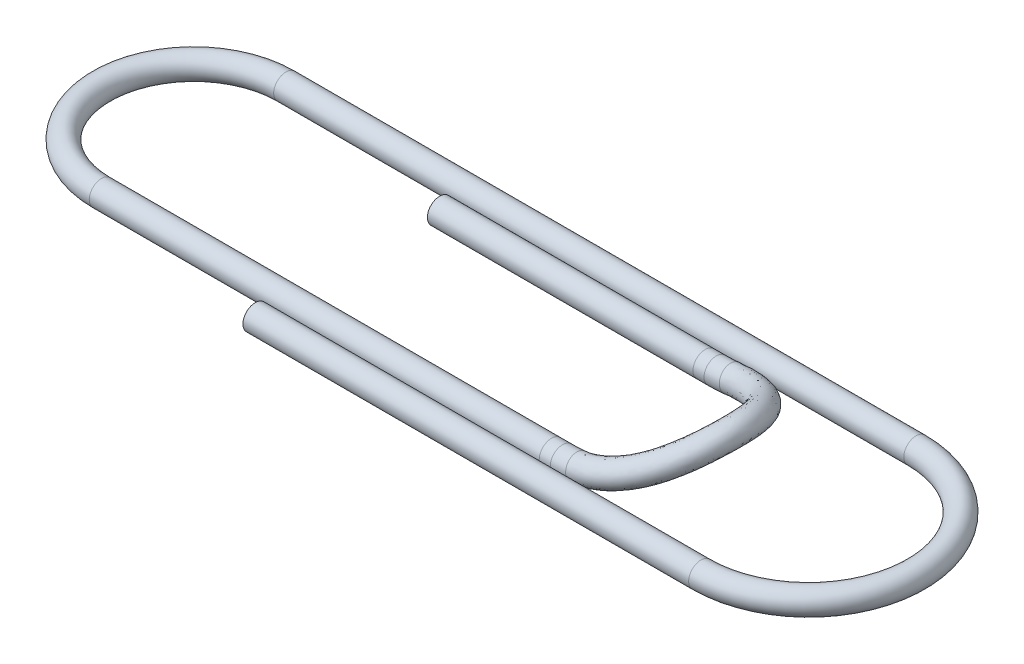
ISO-10303-21;
HEADER;
FILE_DESCRIPTION(('STEP AP214'),'2;1');
FILE_NAME('part.step','',(''),(''),'','','');
FILE_SCHEMA(('AUTOMOTIVE_DESIGN { 1 0 10303 214 1 1 1 1 }'));
ENDSEC;
DATA;
#1=APPLICATION_CONTEXT('core data for automotive mechanical design processes');
#2=APPLICATION_PROTOCOL_DEFINITION('international standard','automotive_design',2000,#1);
#3=PRODUCT_CONTEXT('',#1,'mechanical');
#4=PRODUCT('Part','Part','',(#3));
#5=PRODUCT_RELATED_PRODUCT_CATEGORY('part','',(#4));
#6=PRODUCT_DEFINITION_FORMATION('','',#4);
#7=PRODUCT_DEFINITION_CONTEXT('part definition',#1,'design');
#8=PRODUCT_DEFINITION('design','',#6,#7);
#9=PRODUCT_DEFINITION_SHAPE('','',#8);
#10=(LENGTH_UNIT() NAMED_UNIT(*) SI_UNIT(.MILLI.,.METRE.));
#11=(NAMED_UNIT(*) PLANE_ANGLE_UNIT() SI_UNIT($,.RADIAN.));
#12=(NAMED_UNIT(*) SI_UNIT($,.STERADIAN.) SOLID_ANGLE_UNIT());
#13=UNCERTAINTY_MEASURE_WITH_UNIT(LENGTH_MEASURE(1.E-05),#10,'distance_accuracy_value','');
#14=(GEOMETRIC_REPRESENTATION_CONTEXT(3) GLOBAL_UNCERTAINTY_ASSIGNED_CONTEXT((#13)) GLOBAL_UNIT_ASSIGNED_CONTEXT((#10,
#11,#12)) REPRESENTATION_CONTEXT('',''));
#15=CARTESIAN_POINT('',(0.,0.,0.));
#16=DIRECTION('',(0.,0.,1.));
#17=DIRECTION('',(1.,0.,0.));
#18=AXIS2_PLACEMENT_3D('',#15,#16,#17);
#19=CARTESIAN_POINT('',(0.,0.,6.));
#20=DIRECTION('',(-1.,0.,0.));
#21=DIRECTION('',(0.,-3.67789796320017E-05,0.999999999323653));
#22=AXIS2_PLACEMENT_3D('',#19,#20,#21);
#23=PLANE('',#22);
#24=CARTESIAN_POINT('',(0.,0.,6.));
#25=DIRECTION('',(-1.,0.,0.));
#26=DIRECTION('',(0.,-3.67789796320017E-05,0.999999999323653));
#27=AXIS2_PLACEMENT_3D('',#24,#25,#26);
#28=CIRCLE('',#27,0.4);
#29=CARTESIAN_POINT('',(0.,-1.47115918528007E-05,6.39999999972946));
#30=VERTEX_POINT('',#29);
#31=EDGE_CURVE('E146',#30,#30,#28,.T.);
#32=ORIENTED_EDGE('',*,*,#31,.T.);
#33=EDGE_LOOP('',(#32));
#34=FACE_BOUND('',#33,.T.);
#35=ADVANCED_FACE('F95',(#34),#23,.T.);
#36=CARTESIAN_POINT('',(0.,0.,0.));
#37=DIRECTION('',(1.,0.,0.));
#38=DIRECTION('',(0.,0.,-1.));
#39=AXIS2_PLACEMENT_3D('',#36,#37,#38);
#40=PLANE('',#39);
#41=CARTESIAN_POINT('',(0.,0.,0.));
#42=DIRECTION('',(1.,0.,0.));
#43=DIRECTION('',(0.,0.,-1.));
#44=AXIS2_PLACEMENT_3D('',#41,#42,#43);
#45=CIRCLE('',#44,0.4);
#46=CARTESIAN_POINT('',(0.,0.,-0.4));
#47=VERTEX_POINT('',#46);
#48=EDGE_CURVE('E12',#47,#47,#45,.T.);
#49=ORIENTED_EDGE('',*,*,#48,.F.);
#50=EDGE_LOOP('',(#49));
#51=FACE_BOUND('',#50,.T.);
#52=ADVANCED_FACE('F155',(#51),#40,.F.);
#53=CARTESIAN_POINT('',(0.,0.,6.));
#54=DIRECTION('',(1.,0.,0.));
#55=DIRECTION('',(0.,0.,-1.));
#56=AXIS2_PLACEMENT_3D('',#53,#54,#55);
#57=CYLINDRICAL_SURFACE('',#56,0.4);
#58=CARTESIAN_POINT('',(14.5,0.,5.99999999999999));
#59=DIRECTION('',(-1.,0.,0.));
#60=DIRECTION('',(0.,-3.67789796320017E-05,0.999999999323653));
#61=AXIS2_PLACEMENT_3D('',#58,#59,#60);
#62=CIRCLE('',#61,0.4);
#63=CARTESIAN_POINT('',(14.5,0.,6.39999999999999));
#64=VERTEX_POINT('',#63);
#65=EDGE_CURVE('E142',#64,#64,#62,.T.);
#66=ORIENTED_EDGE('',*,*,#65,.T.);
#67=EDGE_LOOP('',(#66));
#68=FACE_BOUND('',#67,.T.);
#69=ORIENTED_EDGE('',*,*,#31,.F.);
#70=EDGE_LOOP('',(#69));
#71=FACE_BOUND('',#70,.T.);
#72=ADVANCED_FACE('F152',(#68,#71),#57,.T.);
#73=CARTESIAN_POINT('',(14.5,0.,2.5));
#74=DIRECTION('',(0.,1.,0.));
#75=DIRECTION('',(0.,0.,1.));
#76=AXIS2_PLACEMENT_3D('',#73,#74,#75);
#77=TOROIDAL_SURFACE('',#76,3.5,0.4);
#78=CARTESIAN_POINT('',(14.5,0.,-1.));
#79=DIRECTION('',(1.,0.,0.));
#80=DIRECTION('',(0.,-3.67789796320017E-05,-0.999999999323653));
#81=AXIS2_PLACEMENT_3D('',#78,#79,#80);
#82=CIRCLE('',#81,0.4);
#83=CARTESIAN_POINT('',(14.5,0.,-1.4));
#84=VERTEX_POINT('',#83);
#85=EDGE_CURVE('E138',#84,#84,#82,.T.);
#86=CARTESIAN_POINT('',(14.5,0.,2.5));
#87=DIRECTION('',(0.,1.,0.));
#88=DIRECTION('',(0.,0.,1.));
#89=AXIS2_PLACEMENT_3D('',#86,#87,#88);
#90=CIRCLE('',#89,3.9);
#91=EDGE_CURVE('',#64,#84,#90,.T.);
#92=ORIENTED_EDGE('',*,*,#65,.F.);
#93=ORIENTED_EDGE('',*,*,#85,.T.);
#94=ORIENTED_EDGE('',*,*,#91,.T.);
#95=ORIENTED_EDGE('',*,*,#91,.F.);
#96=EDGE_LOOP('',(#92,#94,#93,#95));
#97=FACE_BOUND('',#96,.T.);
#98=ADVANCED_FACE('F154',(#97),#77,.T.);
#99=CARTESIAN_POINT('',(14.5,0.,-1.));
#100=DIRECTION('',(-1.,0.,0.));
#101=DIRECTION('',(0.,0.,1.));
#102=AXIS2_PLACEMENT_3D('',#99,#100,#101);
#103=CYLINDRICAL_SURFACE('',#102,0.4);
#104=CARTESIAN_POINT('',(-6.,0.,-0.999999999999997));
#105=DIRECTION('',(1.,0.,0.));
#106=DIRECTION('',(0.,-3.67789796320017E-05,-0.999999999323653));
#107=AXIS2_PLACEMENT_3D('',#104,#105,#106);
#108=CIRCLE('',#107,0.4);
#109=CARTESIAN_POINT('',(-6.,0.,-1.4));
#110=VERTEX_POINT('',#109);
#111=EDGE_CURVE('E134',#110,#110,#108,.T.);
#112=ORIENTED_EDGE('',*,*,#111,.T.);
#113=EDGE_LOOP('',(#112));
#114=FACE_BOUND('',#113,.T.);
#115=ORIENTED_EDGE('',*,*,#85,.F.);
#116=EDGE_LOOP('',(#115));
#117=FACE_BOUND('',#116,.T.);
#118=ADVANCED_FACE('F162',(#114,#117),#103,.T.);
#119=CARTESIAN_POINT('',(-6.,0.,2.));
#120=DIRECTION('',(0.,1.,0.));
#121=DIRECTION('',(0.,0.,1.));
#122=AXIS2_PLACEMENT_3D('',#119,#120,#121);
#123=TOROIDAL_SURFACE('',#122,3.,0.4);
#124=CARTESIAN_POINT('',(-6.,0.,5.));
#125=DIRECTION('',(-1.,0.,0.));
#126=DIRECTION('',(0.,-3.67789796320017E-05,0.999999999323653));
#127=AXIS2_PLACEMENT_3D('',#124,#125,#126);
#128=CIRCLE('',#127,0.4);
#129=CARTESIAN_POINT('',(-6.,0.,5.4));
#130=VERTEX_POINT('',#129);
#131=EDGE_CURVE('E130',#130,#130,#128,.T.);
#132=CARTESIAN_POINT('',(-6.,0.,2.));
#133=DIRECTION('',(0.,1.,0.));
#134=DIRECTION('',(0.,0.,1.));
#135=AXIS2_PLACEMENT_3D('',#132,#133,#134);
#136=CIRCLE('',#135,3.4);
#137=EDGE_CURVE('',#110,#130,#136,.T.);
#138=ORIENTED_EDGE('',*,*,#111,.F.);
#139=ORIENTED_EDGE('',*,*,#131,.T.);
#140=ORIENTED_EDGE('',*,*,#137,.T.);
#141=ORIENTED_EDGE('',*,*,#137,.F.);
#142=EDGE_LOOP('',(#138,#140,#139,#141));
#143=FACE_BOUND('',#142,.T.);
#144=ADVANCED_FACE('F202',(#143),#123,.T.);
#145=CARTESIAN_POINT('',(-6.,0.,5.));
#146=DIRECTION('',(1.,0.,0.));
#147=DIRECTION('',(0.,0.,-1.));
#148=AXIS2_PLACEMENT_3D('',#145,#146,#147);
#149=CYLINDRICAL_SURFACE('',#148,0.4);
#150=CARTESIAN_POINT('',(8.63934945478196,0.,5.));
#151=DIRECTION('',(-1.,0.,0.));
#152=DIRECTION('',(0.,-3.67789796320017E-05,0.999999999323653));
#153=AXIS2_PLACEMENT_3D('',#150,#151,#152);
#154=CIRCLE('',#153,0.4);
#155=CARTESIAN_POINT('',(8.63934945478196,-1.47115918528007E-05,5.39999999972946));
#156=VERTEX_POINT('',#155);
#157=EDGE_CURVE('E126',#156,#156,#154,.T.);
#158=ORIENTED_EDGE('',*,*,#157,.T.);
#159=EDGE_LOOP('',(#158));
#160=FACE_BOUND('',#159,.T.);
#161=ORIENTED_EDGE('',*,*,#131,.F.);
#162=EDGE_LOOP('',(#161));
#163=FACE_BOUND('',#162,.T.);
#164=ADVANCED_FACE('F198',(#160,#163),#149,.T.);
#165=CARTESIAN_POINT('',(8.63934945478196,0.,5.));
#166=DIRECTION('',(1.,0.,0.));
#167=DIRECTION('',(0.,0.,-1.));
#168=AXIS2_PLACEMENT_3D('',#165,#166,#167);
#169=CYLINDRICAL_SURFACE('',#168,0.4);
#170=CARTESIAN_POINT('',(9.,0.,5.));
#171=DIRECTION('',(-1.,0.,0.));
#172=DIRECTION('',(0.,-3.67789796320017E-05,0.999999999323653));
#173=AXIS2_PLACEMENT_3D('',#170,#171,#172);
#174=CIRCLE('',#173,0.4);
#175=CARTESIAN_POINT('',(9.,-0.4,5.));
#176=VERTEX_POINT('',#175);
#177=EDGE_CURVE('E122',#176,#176,#174,.T.);
#178=ORIENTED_EDGE('',*,*,#177,.T.);
#179=EDGE_LOOP('',(#178));
#180=FACE_BOUND('',#179,.T.);
#181=ORIENTED_EDGE('',*,*,#157,.F.);
#182=EDGE_LOOP('',(#181));
#183=FACE_BOUND('',#182,.T.);
#184=ADVANCED_FACE('F194',(#180,#183),#169,.T.);
#185=CARTESIAN_POINT('',(9.,5.,5.));
#186=DIRECTION('',(0.,0.,1.));
#187=DIRECTION('',(1.,0.,0.));
#188=AXIS2_PLACEMENT_3D('',#185,#186,#187);
#189=TOROIDAL_SURFACE('',#188,5.,0.4);
#190=CARTESIAN_POINT('',(9.5,0.0250628144669003,5.));
#191=DIRECTION('',(-0.99498743710662,-0.1,0.));
#192=DIRECTION('',(3.67789796308803E-06,-3.65946226834412E-05,0.999999999323653));
#193=AXIS2_PLACEMENT_3D('',#190,#191,#192);
#194=CIRCLE('',#193,0.4);
#195=CARTESIAN_POINT('',(9.54,-0.372932160375748,5.));
#196=VERTEX_POINT('',#195);
#197=EDGE_CURVE('E118',#196,#196,#194,.T.);
#198=CARTESIAN_POINT('',(9.,5.,5.));
#199=DIRECTION('',(0.,0.,1.));
#200=DIRECTION('',(1.,0.,0.));
#201=AXIS2_PLACEMENT_3D('',#198,#199,#200);
#202=CIRCLE('',#201,5.4);
#203=EDGE_CURVE('',#176,#196,#202,.T.);
#204=ORIENTED_EDGE('',*,*,#177,.F.);
#205=ORIENTED_EDGE('',*,*,#197,.T.);
#206=ORIENTED_EDGE('',*,*,#203,.T.);
#207=ORIENTED_EDGE('',*,*,#203,.F.);
#208=EDGE_LOOP('',(#204,#206,#205,#207));
#209=FACE_BOUND('',#208,.T.);
#210=ADVANCED_FACE('F185',(#209),#189,.T.);
#211=CARTESIAN_POINT('',(9.50000147115919,0.025048176617827,5.39999999972946));
#212=CARTESIAN_POINT('',(9.6830793009875,0.0434481908291321,5.39999999972946));
#213=CARTESIAN_POINT('',(9.88967413291377,0.0754603427618101,5.37975372842546));
#214=CARTESIAN_POINT('',(10.2626610468463,0.153137695952684,5.30328457727294));
#215=CARTESIAN_POINT('',(10.4426510057668,0.200155385232109,5.24709200462185));
#216=CARTESIAN_POINT('',(10.9564777619113,0.357844367441938,5.03119937733663));
#217=CARTESIAN_POINT('',(11.2638571462447,0.484870213265091,4.82506720357744));
#218=CARTESIAN_POINT('',(12.0349655685928,0.876400294122425,4.05748812102037));
#219=CARTESIAN_POINT('',(12.3709709432069,1.1444496245592,3.3234279176381));
#220=CARTESIAN_POINT('',(12.3741127706822,1.14680572213331,1.68785998832685));
#221=CARTESIAN_POINT('',(12.0377579387881,0.877997819221149,0.945918248653502));
#222=CARTESIAN_POINT('',(11.264157454397,0.484969035084924,0.174927135019827));
#223=CARTESIAN_POINT('',(10.9569596093532,0.357903515251362,-0.0313393828474956));
#224=CARTESIAN_POINT('',(10.4429855382769,0.200125822250454,-0.247350218335565));
#225=CARTESIAN_POINT('',(10.2629572242431,0.153111161783667,-0.30349943449724));
#226=CARTESIAN_POINT('',(9.88986027244377,0.075461502151417,-0.379839600975372));
#227=CARTESIAN_POINT('',(9.68326557655275,0.0434816979339795,-0.4));
#228=CARTESIAN_POINT('',(9.5,0.0250628144669003,-0.4));
#229=CARTESIAN_POINT('',(9.42000147121329,0.821038125764758,5.40002942291317));
#230=CARTESIAN_POINT('',(9.57446925687998,0.836562722348195,5.40002942291317));
#231=CARTESIAN_POINT('',(9.75216152077322,0.863945646536679,5.3829508559771));
#232=CARTESIAN_POINT('',(10.0770192369003,0.931593362987844,5.31643411552319));
#233=CARTESIAN_POINT('',(10.2362377973502,0.973070525247303,5.26699364513476));
#234=CARTESIAN_POINT('',(10.6968810342561,1.11442270911794,5.07362536998192));
#235=CARTESIAN_POINT('',(10.9785693993587,1.22996127441426,4.88734472340038));
#236=CARTESIAN_POINT('',(11.7083613686525,1.60051325026615,4.16089342500537));
#237=CARTESIAN_POINT('',(12.0795421631859,1.88941996700189,3.40985511199249));
#238=CARTESIAN_POINT('',(12.0830138830591,1.89202345379897,1.60244298937603));
#239=CARTESIAN_POINT('',(11.711291737056,1.60217878966498,0.842677509315444));
#240=CARTESIAN_POINT('',(10.978676861002,1.22997248735379,0.112534175789367));
#241=CARTESIAN_POINT('',(10.6971905328002,1.11442746502762,-0.0737970254316509));
#242=CARTESIAN_POINT('',(10.2365606526625,0.973040561511859,-0.267208429085684));
#243=CARTESIAN_POINT('',(10.077371812686,0.931582202908956,-0.316591402228111));
#244=CARTESIAN_POINT('',(9.75246585819454,0.863968561205082,-0.382985418859033));
#245=CARTESIAN_POINT('',(9.57468908306714,0.836599601961221,-0.4));
#246=CARTESIAN_POINT('',(9.42,0.821052764152196,-0.4));
#247=CARTESIAN_POINT('',(9.41999852889492,0.821067401462904,4.60002942345425));
#248=CARTESIAN_POINT('',(9.54731309648765,0.83386299694931,4.60002942345425));
#249=CARTESIAN_POINT('',(9.64546579846612,0.850186204018086,4.5885679270656));
#250=CARTESIAN_POINT('',(9.87209325043547,0.897450504908436,4.54218793587542));
#251=CARTESIAN_POINT('',(9.98541683867558,0.92689593544813,4.50720925941528));
#252=CARTESIAN_POINT('',(10.3179567450541,1.02908469771437,4.36765366368657));
#253=CARTESIAN_POINT('',(10.5275576734233,1.11495290936497,4.22949393676593));
#254=CARTESIAN_POINT('',(11.0638221575603,1.38724325983546,3.69568473209658));
#255=CARTESIAN_POINT('',(11.3349757748863,1.59855257215875,3.13394232615042));
#256=CARTESIAN_POINT('',(11.3373949297041,1.60036671981724,1.87471025473921));
#257=CARTESIAN_POINT('',(11.0659224529956,1.38839984511485,1.30689153658588));
#258=CARTESIAN_POINT('',(10.5276885838935,1.11494732973049,0.770474514841459));
#259=CARTESIAN_POINT('',(10.3179254872968,1.02893425071009,0.632018658766584));
#260=CARTESIAN_POINT('',(9.9858378599298,0.926854965995278,0.492618315071923));
#261=CARTESIAN_POINT('',(9.87269723491998,0.897462062259042,0.457725119852782));
#262=CARTESIAN_POINT('',(9.64611428915862,0.850237258948105,0.411446915766361));
#263=CARTESIAN_POINT('',(9.54767318599733,0.833884402144391,0.4));
#264=CARTESIAN_POINT('',(9.42,0.821052764152196,0.4));
#265=CARTESIAN_POINT('',(9.49999852884081,0.0250774523159738,4.60000000027054));
#266=CARTESIAN_POINT('',(9.65592314059517,0.0407484654302475,4.60000000027054));
#267=CARTESIAN_POINT('',(9.78297841060667,0.0617009002432171,4.58537079951395));
#268=CARTESIAN_POINT('',(10.0577350603815,0.118994837873276,4.52903839762517));
#269=CARTESIAN_POINT('',(10.1918300470921,0.153980795432936,4.48730761890237));
#270=CARTESIAN_POINT('',(10.5775534727094,0.272506356038367,4.32522767104128));
#271=CARTESIAN_POINT('',(10.8128454203093,0.369861848215804,4.16721641694302));
#272=CARTESIAN_POINT('',(11.3904263575006,0.663130303691725,3.5922794281115));
#273=CARTESIAN_POINT('',(11.6264045549073,0.853582229716088,3.04751513179604));
#274=CARTESIAN_POINT('',(11.6284938173272,0.855148988151541,1.96012725369003));
#275=CARTESIAN_POINT('',(11.3923886547277,0.664218874670987,1.41013227592393));
#276=CARTESIAN_POINT('',(10.8131691772885,0.369943877461644,0.832867474071919));
#277=CARTESIAN_POINT('',(10.5776945638498,0.272410300933845,0.67447630135074));
#278=CARTESIAN_POINT('',(10.1922627455442,0.153940226733868,0.512476525822042));
#279=CARTESIAN_POINT('',(10.0582826464771,0.118991021133753,0.470817087583655));
#280=CARTESIAN_POINT('',(9.78350870340785,0.0617301998944408,0.41459273365002));
#281=CARTESIAN_POINT('',(9.65624967948294,0.0407664981171492,0.4));
#282=CARTESIAN_POINT('',(9.5,0.0250628144669004,0.4));
#283=CARTESIAN_POINT('',(9.57999852878671,-0.770912496830957,4.59997057708683));
#284=CARTESIAN_POINT('',(9.76453318470269,-0.752366066088816,4.59997057708683));
#285=CARTESIAN_POINT('',(9.92049102274722,-0.726784403531652,4.58217367196231));
#286=CARTESIAN_POINT('',(10.2433768703274,-0.659460829161884,4.51588885937491));
#287=CARTESIAN_POINT('',(10.3982432555087,-0.618934344582257,4.46740597838946));
#288=CARTESIAN_POINT('',(10.8371502003646,-0.484071985637638,4.28280167839599));
#289=CARTESIAN_POINT('',(11.0981331671953,-0.375229212933366,4.10493889712011));
#290=CARTESIAN_POINT('',(11.7170305574409,-0.0609826524520048,3.48887412412642));
#291=CARTESIAN_POINT('',(11.9178333349282,0.108611887273428,2.96108793744166));
#292=CARTESIAN_POINT('',(11.9195927049503,0.109931256485844,2.04554425264085));
#293=CARTESIAN_POINT('',(11.7188548564599,-0.0599620957728788,1.51337301526199));
#294=CARTESIAN_POINT('',(11.0986497706835,-0.375059574807205,0.89526043330238));
#295=CARTESIAN_POINT('',(10.8374636404028,-0.484113648842402,0.716933943934895));
#296=CARTESIAN_POINT('',(10.3986876311586,-0.618974512527542,0.532334736572161));
#297=CARTESIAN_POINT('',(10.2438680580342,-0.659480019991536,0.483909055314528));
#298=CARTESIAN_POINT('',(9.92090311765708,-0.726776859159224,0.417738551533679));
#299=CARTESIAN_POINT('',(9.76482617296855,-0.752351405910092,0.4));
#300=CARTESIAN_POINT('',(9.58,-0.770927135218396,0.4));
#301=CARTESIAN_POINT('',(9.58000147110508,-0.770941772529103,5.39997057654576));
#302=CARTESIAN_POINT('',(9.79168934509503,-0.749666340689931,5.39997057654576));
#303=CARTESIAN_POINT('',(10.0271867450543,-0.713024961013059,5.37655660087381));
#304=CARTESIAN_POINT('',(10.4483028567923,-0.625317971082476,5.29013503902268));
#305=CARTESIAN_POINT('',(10.6490642141833,-0.572759754783084,5.22719036410894));
#306=CARTESIAN_POINT('',(11.2160744895665,-0.398733974234067,4.98877338469134));
#307=CARTESIAN_POINT('',(11.5491448931306,-0.260220847884079,4.76278968375449));
#308=CARTESIAN_POINT('',(12.3615697685331,0.152287337978695,3.95408281703536));
#309=CARTESIAN_POINT('',(12.6623997232278,0.399479282116501,3.23700072328372));
#310=CARTESIAN_POINT('',(12.6652116583053,0.401587990467645,1.77327698727767));
#311=CARTESIAN_POINT('',(12.3642241405203,0.15381684877732,1.04915898799156));
#312=CARTESIAN_POINT('',(11.5496380477921,-0.260034417183942,0.237320094250287));
#313=CARTESIAN_POINT('',(11.2167286859062,-0.398620434524894,0.0111182597366596));
#314=CARTESIAN_POINT('',(10.6494104238914,-0.572788917010951,-0.227492007585445));
#315=CARTESIAN_POINT('',(10.4485426358002,-0.625359879341621,-0.29040746676637));
#316=CARTESIAN_POINT('',(10.027254686693,-0.713045556902248,-0.376693783091711));
#317=CARTESIAN_POINT('',(9.79184207003835,-0.749636206093262,-0.4));
#318=CARTESIAN_POINT('',(9.58,-0.770927135218396,-0.4));
#319=CARTESIAN_POINT('',(9.50000147115919,0.025048176617827,5.39999999972946));
#320=CARTESIAN_POINT('',(9.6830793009875,0.0434481908291321,5.39999999972946));
#321=CARTESIAN_POINT('',(9.88967413291377,0.0754603427618101,5.37975372842546));
#322=CARTESIAN_POINT('',(10.2626610468463,0.153137695952684,5.30328457727294));
#323=CARTESIAN_POINT('',(10.4426510057668,0.200155385232109,5.24709200462185));
#324=CARTESIAN_POINT('',(10.9564777619113,0.357844367441938,5.03119937733663));
#325=CARTESIAN_POINT('',(11.2638571462447,0.484870213265091,4.82506720357744));
#326=CARTESIAN_POINT('',(12.0349655685928,0.876400294122425,4.05748812102037));
#327=CARTESIAN_POINT('',(12.3709709432069,1.1444496245592,3.3234279176381));
#328=CARTESIAN_POINT('',(12.3741127706822,1.14680572213331,1.68785998832685));
#329=CARTESIAN_POINT('',(12.0377579387881,0.877997819221149,0.945918248653502));
#330=CARTESIAN_POINT('',(11.264157454397,0.484969035084924,0.174927135019827));
#331=CARTESIAN_POINT('',(10.9569596093532,0.357903515251362,-0.0313393828474956));
#332=CARTESIAN_POINT('',(10.4429855382769,0.200125822250454,-0.247350218335565));
#333=CARTESIAN_POINT('',(10.2629572242431,0.153111161783667,-0.30349943449724));
#334=CARTESIAN_POINT('',(9.88986027244377,0.075461502151417,-0.379839600975372));
#335=CARTESIAN_POINT('',(9.68326557655275,0.0434816979339795,-0.4));
#336=CARTESIAN_POINT('',(9.5,0.0250628144669003,-0.4));
#337=(BOUNDED_SURFACE() B_SPLINE_SURFACE(3,3,((#211,#212,#213,#214,#215,#216,#217,#218,#219,
#220,#221,#222,#223,#224,#225,#226,#227,#228),(#229,#230,#231,#232,#233,#234,#235,#236,#237,
#238,#239,#240,#241,#242,#243,#244,#245,#246),(#247,#248,#249,#250,#251,#252,#253,#254,#255,
#256,#257,#258,#259,#260,#261,#262,#263,#264),(#265,#266,#267,#268,#269,#270,#271,#272,#273,
#274,#275,#276,#277,#278,#279,#280,#281,#282),(#283,#284,#285,#286,#287,#288,#289,#290,#291,
#292,#293,#294,#295,#296,#297,#298,#299,#300),(#301,#302,#303,#304,#305,#306,#307,#308,#309,
#310,#311,#312,#313,#314,#315,#316,#317,#318),(#319,#320,#321,#322,#323,#324,#325,#326,#327,
#328,#329,#330,#331,#332,#333,#334,#335,#336)),.UNSPECIFIED.,.T.,.F.,
.F.) B_SPLINE_SURFACE_WITH_KNOTS((4,3,4),(4,2,2,2,2,2,2,2,4),(0.,0.5,1.),(0.800963346528752,
0.806706609950869,0.812449873372985,0.823936400217219,0.846821969128121,0.869712418555657,
0.881206359688497,0.886953330254917,0.892700300821337),
.UNSPECIFIED.) GEOMETRIC_REPRESENTATION_ITEM() RATIONAL_B_SPLINE_SURFACE(((1.,1.,1.,1.,1.,1.,1.,
1.,1.,1.,1.,1.,1.,1.,1.,1.,1.,1.),(0.333333333333333,0.333333333333333,0.333333333333333,
0.333333333333333,0.333333333333333,0.333333333333333,0.333333333333333,0.333333333333333,
0.333333333333333,0.333333333333333,0.333333333333333,0.333333333333333,0.333333333333333,
0.333333333333333,0.333333333333333,0.333333333333333,0.333333333333333,0.333333333333333),
(0.333333333333333,0.333333333333333,0.333333333333333,0.333333333333333,0.333333333333333,
0.333333333333333,0.333333333333333,0.333333333333333,0.333333333333333,0.333333333333333,
0.333333333333333,0.333333333333333,0.333333333333333,0.333333333333333,0.333333333333333,
0.333333333333333,0.333333333333333,0.333333333333333),(1.,1.,1.,1.,1.,1.,1.,1.,1.,1.,1.,1.,1.,
1.,1.,1.,1.,1.),(0.333333333333333,0.333333333333333,0.333333333333333,0.333333333333333,
0.333333333333333,0.333333333333333,0.333333333333333,0.333333333333333,0.333333333333333,
0.333333333333333,0.333333333333333,0.333333333333333,0.333333333333333,0.333333333333333,
0.333333333333333,0.333333333333333,0.333333333333333,0.333333333333333),(0.333333333333333,
0.333333333333333,0.333333333333333,0.333333333333333,0.333333333333333,0.333333333333333,
0.333333333333333,0.333333333333333,0.333333333333333,0.333333333333333,0.333333333333333,
0.333333333333333,0.333333333333333,0.333333333333333,0.333333333333333,0.333333333333333,
0.333333333333333,0.333333333333333),(1.,1.,1.,1.,1.,1.,1.,1.,1.,1.,1.,1.,1.,1.,1.,1.,1.,1.))) REPRESENTATION_ITEM('') SURFACE());
#338=CARTESIAN_POINT('',(9.5,0.0250628144669004,0.));
#339=DIRECTION('',(0.99498743710662,0.1,0.));
#340=DIRECTION('',(0.,0.,-1.));
#341=AXIS2_PLACEMENT_3D('',#338,#339,#340);
#342=CIRCLE('',#341,0.4);
#343=CARTESIAN_POINT('',(9.54,-0.372932160375748,0.));
#344=VERTEX_POINT('',#343);
#345=EDGE_CURVE('E112',#344,#344,#342,.T.);
#346=ORIENTED_EDGE('',*,*,#345,.T.);
#347=EDGE_LOOP('',(#346));
#348=FACE_BOUND('',#347,.T.);
#349=ORIENTED_EDGE('',*,*,#197,.F.);
#350=EDGE_LOOP('',(#349));
#351=FACE_BOUND('',#350,.T.);
#352=ADVANCED_FACE('F179',(#348,#351),#337,.F.);
#353=CARTESIAN_POINT('',(9.,5.,0.));
#354=DIRECTION('',(0.,0.,-1.));
#355=DIRECTION('',(-1.,0.,0.));
#356=AXIS2_PLACEMENT_3D('',#353,#354,#355);
#357=TOROIDAL_SURFACE('',#356,5.,0.4);
#358=CARTESIAN_POINT('',(9.,0.,0.));
#359=DIRECTION('',(1.,0.,0.));
#360=DIRECTION('',(0.,0.,-1.));
#361=AXIS2_PLACEMENT_3D('',#358,#359,#360);
#362=CIRCLE('',#361,0.4);
#363=CARTESIAN_POINT('',(9.,-0.4,0.));
#364=VERTEX_POINT('',#363);
#365=EDGE_CURVE('E107',#364,#364,#362,.T.);
#366=CARTESIAN_POINT('',(9.,5.,0.));
#367=DIRECTION('',(0.,0.,-1.));
#368=DIRECTION('',(-1.,0.,0.));
#369=AXIS2_PLACEMENT_3D('',#366,#367,#368);
#370=CIRCLE('',#369,5.4);
#371=EDGE_CURVE('',#344,#364,#370,.T.);
#372=ORIENTED_EDGE('',*,*,#345,.F.);
#373=ORIENTED_EDGE('',*,*,#365,.T.);
#374=ORIENTED_EDGE('',*,*,#371,.T.);
#375=ORIENTED_EDGE('',*,*,#371,.F.);
#376=EDGE_LOOP('',(#372,#374,#373,#375));
#377=FACE_BOUND('',#376,.T.);
#378=ADVANCED_FACE('F173',(#377),#357,.T.);
#379=CARTESIAN_POINT('',(9.,0.,0.));
#380=DIRECTION('',(-1.,0.,0.));
#381=DIRECTION('',(0.,0.,1.));
#382=AXIS2_PLACEMENT_3D('',#379,#380,#381);
#383=CYLINDRICAL_SURFACE('',#382,0.4);
#384=CARTESIAN_POINT('',(8.63934945478196,0.,0.));
#385=DIRECTION('',(1.,0.,0.));
#386=DIRECTION('',(0.,0.,-1.));
#387=AXIS2_PLACEMENT_3D('',#384,#385,#386);
#388=CIRCLE('',#387,0.4);
#389=CARTESIAN_POINT('',(8.63934945478196,0.,-0.4));
#390=VERTEX_POINT('',#389);
#391=EDGE_CURVE('E102',#390,#390,#388,.T.);
#392=ORIENTED_EDGE('',*,*,#391,.T.);
#393=EDGE_LOOP('',(#392));
#394=FACE_BOUND('',#393,.T.);
#395=ORIENTED_EDGE('',*,*,#365,.F.);
#396=EDGE_LOOP('',(#395));
#397=FACE_BOUND('',#396,.T.);
#398=ADVANCED_FACE('F168',(#394,#397),#383,.T.);
#399=CARTESIAN_POINT('',(8.63934945478196,0.,0.));
#400=DIRECTION('',(-1.,0.,0.));
#401=DIRECTION('',(0.,0.,1.));
#402=AXIS2_PLACEMENT_3D('',#399,#400,#401);
#403=CYLINDRICAL_SURFACE('',#402,0.4);
#404=ORIENTED_EDGE('',*,*,#48,.T.);
#405=EDGE_LOOP('',(#404));
#406=FACE_BOUND('',#405,.T.);
#407=ORIENTED_EDGE('',*,*,#391,.F.);
#408=EDGE_LOOP('',(#407));
#409=FACE_BOUND('',#408,.T.);
#410=ADVANCED_FACE('F166',(#406,#409),#403,.T.);
#411=CLOSED_SHELL('',(#35,#52,#72,#98,#118,#144,#164,#184,#210,#352,#378,#398,#410));
#412=MANIFOLD_SOLID_BREP('B2',#411);
#413=ADVANCED_BREP_SHAPE_REPRESENTATION('',(#18,#412),#14);
#414=SHAPE_DEFINITION_REPRESENTATION(#9,#413);
ENDSEC;
END-ISO-10303-21;
